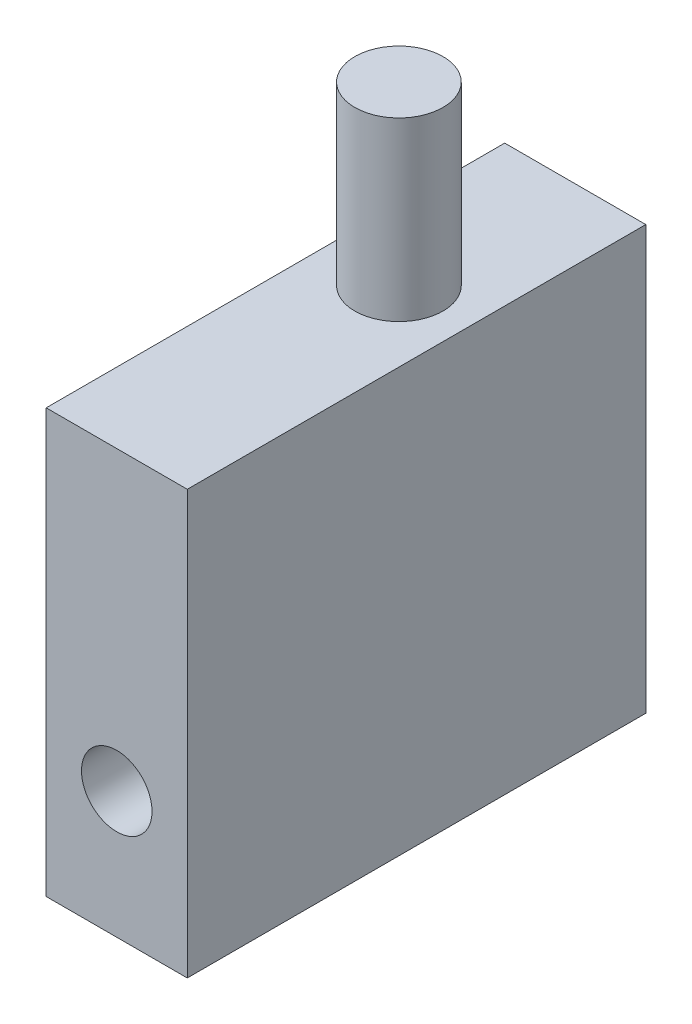
ISO-10303-21;
HEADER;
FILE_DESCRIPTION(('STEP AP214'),'2;1');
FILE_NAME('part.step','',(''),(''),'','','');
FILE_SCHEMA(('AUTOMOTIVE_DESIGN { 1 0 10303 214 1 1 1 1 }'));
ENDSEC;
DATA;
#1=APPLICATION_CONTEXT('core data for automotive mechanical design processes');
#2=APPLICATION_PROTOCOL_DEFINITION('international standard','automotive_design',2000,#1);
#3=PRODUCT_CONTEXT('',#1,'mechanical');
#4=PRODUCT('Part','Part','',(#3));
#5=PRODUCT_RELATED_PRODUCT_CATEGORY('part','',(#4));
#6=PRODUCT_DEFINITION_FORMATION('','',#4);
#7=PRODUCT_DEFINITION_CONTEXT('part definition',#1,'design');
#8=PRODUCT_DEFINITION('design','',#6,#7);
#9=PRODUCT_DEFINITION_SHAPE('','',#8);
#10=(LENGTH_UNIT() NAMED_UNIT(*) SI_UNIT(.MILLI.,.METRE.));
#11=(NAMED_UNIT(*) PLANE_ANGLE_UNIT() SI_UNIT($,.RADIAN.));
#12=(NAMED_UNIT(*) SI_UNIT($,.STERADIAN.) SOLID_ANGLE_UNIT());
#13=UNCERTAINTY_MEASURE_WITH_UNIT(LENGTH_MEASURE(1.E-05),#10,'distance_accuracy_value','');
#14=(GEOMETRIC_REPRESENTATION_CONTEXT(3) GLOBAL_UNCERTAINTY_ASSIGNED_CONTEXT((#13)) GLOBAL_UNIT_ASSIGNED_CONTEXT((#10,
#11,#12)) REPRESENTATION_CONTEXT('',''));
#15=CARTESIAN_POINT('',(0.,0.,0.));
#16=DIRECTION('',(0.,0.,1.));
#17=DIRECTION('',(1.,0.,0.));
#18=AXIS2_PLACEMENT_3D('',#15,#16,#17);
#19=CARTESIAN_POINT('',(0.,0.,13.));
#20=DIRECTION('',(1.,0.,0.));
#21=DIRECTION('',(0.,0.,-1.));
#22=AXIS2_PLACEMENT_3D('',#19,#20,#21);
#23=PLANE('',#22);
#24=DIRECTION('',(0.,-1.,0.));
#25=VECTOR('',#24,1.);
#26=CARTESIAN_POINT('',(0.,0.,0.));
#27=LINE('',#26,#25);
#28=CARTESIAN_POINT('',(0.,12.,0.));
#29=VERTEX_POINT('',#28);
#30=CARTESIAN_POINT('',(0.,0.,0.));
#31=VERTEX_POINT('',#30);
#32=EDGE_CURVE('E110',#29,#31,#27,.T.);
#33=ORIENTED_EDGE('',*,*,#32,.T.);
#34=DIRECTION('',(0.,0.,-1.));
#35=VECTOR('',#34,1.);
#36=CARTESIAN_POINT('',(0.,0.,13.));
#37=LINE('',#36,#35);
#38=CARTESIAN_POINT('',(0.,0.,13.));
#39=VERTEX_POINT('',#38);
#40=EDGE_CURVE('E42',#39,#31,#37,.T.);
#41=ORIENTED_EDGE('',*,*,#40,.F.);
#42=DIRECTION('',(0.,-1.,0.));
#43=VECTOR('',#42,1.);
#44=CARTESIAN_POINT('',(0.,0.,13.));
#45=LINE('',#44,#43);
#46=CARTESIAN_POINT('',(0.,12.,13.));
#47=VERTEX_POINT('',#46);
#48=EDGE_CURVE('E93',#47,#39,#45,.T.);
#49=ORIENTED_EDGE('',*,*,#48,.F.);
#50=DIRECTION('',(0.,0.,-1.));
#51=VECTOR('',#50,1.);
#52=CARTESIAN_POINT('',(0.,12.,13.));
#53=LINE('',#52,#51);
#54=EDGE_CURVE('E106',#47,#29,#53,.T.);
#55=ORIENTED_EDGE('',*,*,#54,.T.);
#56=EDGE_LOOP('',(#33,#41,#49,#55));
#57=FACE_BOUND('',#56,.T.);
#58=ADVANCED_FACE('F39',(#57),#23,.F.);
#59=CARTESIAN_POINT('',(0.,0.,13.));
#60=DIRECTION('',(0.,1.,0.));
#61=DIRECTION('',(0.,0.,1.));
#62=AXIS2_PLACEMENT_3D('',#59,#60,#61);
#63=PLANE('',#62);
#64=DIRECTION('',(1.,0.,0.));
#65=VECTOR('',#64,1.);
#66=CARTESIAN_POINT('',(0.,0.,0.));
#67=LINE('',#66,#65);
#68=CARTESIAN_POINT('',(4.,0.,0.));
#69=VERTEX_POINT('',#68);
#70=EDGE_CURVE('E99',#31,#69,#67,.T.);
#71=ORIENTED_EDGE('',*,*,#70,.T.);
#72=DIRECTION('',(0.,0.,-1.));
#73=VECTOR('',#72,1.);
#74=CARTESIAN_POINT('',(4.,0.,13.));
#75=LINE('',#74,#73);
#76=CARTESIAN_POINT('',(4.,0.,13.));
#77=VERTEX_POINT('',#76);
#78=EDGE_CURVE('E97',#77,#69,#75,.T.);
#79=ORIENTED_EDGE('',*,*,#78,.F.);
#80=DIRECTION('',(1.,0.,0.));
#81=VECTOR('',#80,1.);
#82=CARTESIAN_POINT('',(0.,0.,13.));
#83=LINE('',#82,#81);
#84=EDGE_CURVE('E88',#39,#77,#83,.T.);
#85=ORIENTED_EDGE('',*,*,#84,.F.);
#86=ORIENTED_EDGE('',*,*,#40,.T.);
#87=EDGE_LOOP('',(#71,#79,#85,#86));
#88=FACE_BOUND('',#87,.T.);
#89=ADVANCED_FACE('F98',(#88),#63,.F.);
#90=CARTESIAN_POINT('',(4.,0.,13.));
#91=DIRECTION('',(-1.,0.,0.));
#92=DIRECTION('',(0.,0.,1.));
#93=AXIS2_PLACEMENT_3D('',#90,#91,#92);
#94=PLANE('',#93);
#95=DIRECTION('',(0.,1.,0.));
#96=VECTOR('',#95,1.);
#97=CARTESIAN_POINT('',(4.,0.,0.));
#98=LINE('',#97,#96);
#99=CARTESIAN_POINT('',(4.,12.,0.));
#100=VERTEX_POINT('',#99);
#101=EDGE_CURVE('E74',#69,#100,#98,.T.);
#102=ORIENTED_EDGE('',*,*,#101,.T.);
#103=DIRECTION('',(0.,0.,-1.));
#104=VECTOR('',#103,1.);
#105=CARTESIAN_POINT('',(4.,12.,13.));
#106=LINE('',#105,#104);
#107=CARTESIAN_POINT('',(4.,12.,13.));
#108=VERTEX_POINT('',#107);
#109=EDGE_CURVE('E101',#108,#100,#106,.T.);
#110=ORIENTED_EDGE('',*,*,#109,.F.);
#111=DIRECTION('',(0.,1.,0.));
#112=VECTOR('',#111,1.);
#113=CARTESIAN_POINT('',(4.,0.,13.));
#114=LINE('',#113,#112);
#115=EDGE_CURVE('E91',#77,#108,#114,.T.);
#116=ORIENTED_EDGE('',*,*,#115,.F.);
#117=ORIENTED_EDGE('',*,*,#78,.T.);
#118=EDGE_LOOP('',(#102,#110,#116,#117));
#119=FACE_BOUND('',#118,.T.);
#120=ADVANCED_FACE('F102',(#119),#94,.F.);
#121=CARTESIAN_POINT('',(0.,12.,13.));
#122=DIRECTION('',(0.,-1.,0.));
#123=DIRECTION('',(0.,0.,-1.));
#124=AXIS2_PLACEMENT_3D('',#121,#122,#123);
#125=PLANE('',#124);
#126=CARTESIAN_POINT('',(2.,12.,5.));
#127=DIRECTION('',(0.,1.,0.));
#128=DIRECTION('',(0.,0.,1.));
#129=AXIS2_PLACEMENT_3D('',#126,#127,#128);
#130=CIRCLE('',#129,1.25);
#131=CARTESIAN_POINT('',(2.,12.,6.25));
#132=VERTEX_POINT('',#131);
#133=EDGE_CURVE('E11',#132,#132,#130,.T.);
#134=ORIENTED_EDGE('',*,*,#133,.F.);
#135=EDGE_LOOP('',(#134));
#136=FACE_BOUND('',#135,.T.);
#137=DIRECTION('',(-1.,0.,0.));
#138=VECTOR('',#137,1.);
#139=CARTESIAN_POINT('',(0.,12.,0.));
#140=LINE('',#139,#138);
#141=EDGE_CURVE('E80',#100,#29,#140,.T.);
#142=ORIENTED_EDGE('',*,*,#141,.T.);
#143=ORIENTED_EDGE('',*,*,#54,.F.);
#144=DIRECTION('',(-1.,0.,0.));
#145=VECTOR('',#144,1.);
#146=CARTESIAN_POINT('',(0.,12.,13.));
#147=LINE('',#146,#145);
#148=EDGE_CURVE('E57',#108,#47,#147,.T.);
#149=ORIENTED_EDGE('',*,*,#148,.F.);
#150=ORIENTED_EDGE('',*,*,#109,.T.);
#151=EDGE_LOOP('',(#142,#143,#149,#150));
#152=FACE_BOUND('',#151,.T.);
#153=ADVANCED_FACE('F124',(#136,#152),#125,.F.);
#154=CARTESIAN_POINT('',(0.,0.,13.));
#155=DIRECTION('',(0.,0.,-1.));
#156=DIRECTION('',(-1.,0.,0.));
#157=AXIS2_PLACEMENT_3D('',#154,#155,#156);
#158=PLANE('',#157);
#159=CARTESIAN_POINT('',(2.,3.59,13.));
#160=DIRECTION('',(0.,0.,1.));
#161=DIRECTION('',(1.,0.,0.));
#162=AXIS2_PLACEMENT_3D('',#159,#160,#161);
#163=CIRCLE('',#162,1.);
#164=CARTESIAN_POINT('',(3.,3.59,13.));
#165=VERTEX_POINT('',#164);
#166=EDGE_CURVE('E135',#165,#165,#163,.T.);
#167=ORIENTED_EDGE('',*,*,#166,.F.);
#168=EDGE_LOOP('',(#167));
#169=FACE_BOUND('',#168,.T.);
#170=ORIENTED_EDGE('',*,*,#48,.T.);
#171=ORIENTED_EDGE('',*,*,#84,.T.);
#172=ORIENTED_EDGE('',*,*,#115,.T.);
#173=ORIENTED_EDGE('',*,*,#148,.T.);
#174=EDGE_LOOP('',(#170,#171,#172,#173));
#175=FACE_BOUND('',#174,.T.);
#176=ADVANCED_FACE('F89',(#169,#175),#158,.F.);
#177=CARTESIAN_POINT('',(0.,0.,0.));
#178=DIRECTION('',(0.,0.,-1.));
#179=DIRECTION('',(-1.,0.,0.));
#180=AXIS2_PLACEMENT_3D('',#177,#178,#179);
#181=PLANE('',#180);
#182=CARTESIAN_POINT('',(2.,3.59,0.));
#183=DIRECTION('',(0.,0.,1.));
#184=DIRECTION('',(1.,0.,0.));
#185=AXIS2_PLACEMENT_3D('',#182,#183,#184);
#186=CIRCLE('',#185,1.);
#187=CARTESIAN_POINT('',(3.,3.59,0.));
#188=VERTEX_POINT('',#187);
#189=EDGE_CURVE('E134',#188,#188,#186,.T.);
#190=ORIENTED_EDGE('',*,*,#189,.T.);
#191=EDGE_LOOP('',(#190));
#192=FACE_BOUND('',#191,.T.);
#193=ORIENTED_EDGE('',*,*,#32,.F.);
#194=ORIENTED_EDGE('',*,*,#141,.F.);
#195=ORIENTED_EDGE('',*,*,#101,.F.);
#196=ORIENTED_EDGE('',*,*,#70,.F.);
#197=EDGE_LOOP('',(#193,#194,#195,#196));
#198=FACE_BOUND('',#197,.T.);
#199=ADVANCED_FACE('F127',(#192,#198),#181,.T.);
#200=CARTESIAN_POINT('',(2.,17.,5.));
#201=DIRECTION('',(0.,-1.,0.));
#202=DIRECTION('',(0.,0.,-1.));
#203=AXIS2_PLACEMENT_3D('',#200,#201,#202);
#204=CYLINDRICAL_SURFACE('',#203,1.25);
#205=CARTESIAN_POINT('',(2.,17.,5.));
#206=DIRECTION('',(0.,1.,0.));
#207=DIRECTION('',(0.,0.,1.));
#208=AXIS2_PLACEMENT_3D('',#205,#206,#207);
#209=CIRCLE('',#208,1.25);
#210=CARTESIAN_POINT('',(2.,17.,6.25));
#211=VERTEX_POINT('',#210);
#212=EDGE_CURVE('E114',#211,#211,#209,.T.);
#213=ORIENTED_EDGE('',*,*,#212,.F.);
#214=EDGE_LOOP('',(#213));
#215=FACE_BOUND('',#214,.T.);
#216=ORIENTED_EDGE('',*,*,#133,.T.);
#217=EDGE_LOOP('',(#216));
#218=FACE_BOUND('',#217,.T.);
#219=ADVANCED_FACE('F157',(#215,#218),#204,.T.);
#220=CARTESIAN_POINT('',(2.,17.,5.));
#221=DIRECTION('',(0.,1.,0.));
#222=DIRECTION('',(0.,0.,1.));
#223=AXIS2_PLACEMENT_3D('',#220,#221,#222);
#224=PLANE('',#223);
#225=ORIENTED_EDGE('',*,*,#212,.T.);
#226=EDGE_LOOP('',(#225));
#227=FACE_BOUND('',#226,.T.);
#228=ADVANCED_FACE('F147',(#227),#224,.T.);
#229=CARTESIAN_POINT('',(2.,3.59,0.));
#230=DIRECTION('',(0.,0.,1.));
#231=DIRECTION('',(1.,0.,0.));
#232=AXIS2_PLACEMENT_3D('',#229,#230,#231);
#233=CYLINDRICAL_SURFACE('',#232,1.);
#234=CARTESIAN_POINT('',(3.,3.59,0.));
#235=CARTESIAN_POINT('',(3.,3.59,0.135416666666666));
#236=CARTESIAN_POINT('',(3.,3.59,0.270833333333333));
#237=CARTESIAN_POINT('',(3.,3.59,0.541666666666667));
#238=CARTESIAN_POINT('',(3.,3.59,0.677083333333333));
#239=CARTESIAN_POINT('',(3.,3.59,0.947916666666667));
#240=CARTESIAN_POINT('',(3.,3.59,1.08333333333333));
#241=CARTESIAN_POINT('',(3.,3.59,1.35416666666667));
#242=CARTESIAN_POINT('',(3.,3.59,1.48958333333333));
#243=CARTESIAN_POINT('',(3.,3.59,1.76041666666667));
#244=CARTESIAN_POINT('',(3.,3.59,1.89583333333333));
#245=CARTESIAN_POINT('',(3.,3.59,2.16666666666667));
#246=CARTESIAN_POINT('',(3.,3.59,2.30208333333333));
#247=CARTESIAN_POINT('',(3.,3.59,2.57291666666667));
#248=CARTESIAN_POINT('',(3.,3.59,2.70833333333333));
#249=CARTESIAN_POINT('',(3.,3.59,2.97916666666667));
#250=CARTESIAN_POINT('',(3.,3.59,3.11458333333333));
#251=CARTESIAN_POINT('',(3.,3.59,3.38541666666667));
#252=CARTESIAN_POINT('',(3.,3.59,3.52083333333333));
#253=CARTESIAN_POINT('',(3.,3.59,3.79166666666667));
#254=CARTESIAN_POINT('',(3.,3.59,3.92708333333333));
#255=CARTESIAN_POINT('',(3.,3.59,4.19791666666667));
#256=CARTESIAN_POINT('',(3.,3.59,4.33333333333333));
#257=CARTESIAN_POINT('',(3.,3.59,4.60416666666667));
#258=CARTESIAN_POINT('',(3.,3.59,4.73958333333333));
#259=CARTESIAN_POINT('',(3.,3.59,5.01041666666667));
#260=CARTESIAN_POINT('',(3.,3.59,5.14583333333333));
#261=CARTESIAN_POINT('',(3.,3.59,5.41666666666667));
#262=CARTESIAN_POINT('',(3.,3.59,5.55208333333333));
#263=CARTESIAN_POINT('',(3.,3.59,5.82291666666667));
#264=CARTESIAN_POINT('',(3.,3.59,5.95833333333333));
#265=CARTESIAN_POINT('',(3.,3.59,6.22916666666667));
#266=CARTESIAN_POINT('',(3.,3.59,6.36458333333333));
#267=CARTESIAN_POINT('',(3.,3.59,6.63541666666667));
#268=CARTESIAN_POINT('',(3.,3.59,6.77083333333333));
#269=CARTESIAN_POINT('',(3.,3.59,7.04166666666667));
#270=CARTESIAN_POINT('',(3.,3.59,7.17708333333333));
#271=CARTESIAN_POINT('',(3.,3.59,7.44791666666667));
#272=CARTESIAN_POINT('',(3.,3.59,7.58333333333333));
#273=CARTESIAN_POINT('',(3.,3.59,7.85416666666667));
#274=CARTESIAN_POINT('',(3.,3.59,7.98958333333333));
#275=CARTESIAN_POINT('',(3.,3.59,8.26041666666667));
#276=CARTESIAN_POINT('',(3.,3.59,8.39583333333333));
#277=CARTESIAN_POINT('',(3.,3.59,8.66666666666667));
#278=CARTESIAN_POINT('',(3.,3.59,8.80208333333333));
#279=CARTESIAN_POINT('',(3.,3.59,9.07291666666667));
#280=CARTESIAN_POINT('',(3.,3.59,9.20833333333333));
#281=CARTESIAN_POINT('',(3.,3.59,9.47916666666667));
#282=CARTESIAN_POINT('',(3.,3.59,9.61458333333333));
#283=CARTESIAN_POINT('',(3.,3.59,9.88541666666667));
#284=CARTESIAN_POINT('',(3.,3.59,10.0208333333333));
#285=CARTESIAN_POINT('',(3.,3.59,10.2916666666667));
#286=CARTESIAN_POINT('',(3.,3.59,10.4270833333333));
#287=CARTESIAN_POINT('',(3.,3.59,10.6979166666667));
#288=CARTESIAN_POINT('',(3.,3.59,10.8333333333333));
#289=CARTESIAN_POINT('',(3.,3.59,11.1041666666667));
#290=CARTESIAN_POINT('',(3.,3.59,11.2395833333333));
#291=CARTESIAN_POINT('',(3.,3.59,11.5104166666667));
#292=CARTESIAN_POINT('',(3.,3.59,11.6458333333333));
#293=CARTESIAN_POINT('',(3.,3.59,11.9166666666667));
#294=CARTESIAN_POINT('',(3.,3.59,12.0520833333333));
#295=CARTESIAN_POINT('',(3.,3.59,12.3229166666667));
#296=CARTESIAN_POINT('',(3.,3.59,12.4583333333333));
#297=CARTESIAN_POINT('',(3.,3.59,12.7291666666667));
#298=CARTESIAN_POINT('',(3.,3.59,12.8645833333333));
#299=CARTESIAN_POINT('',(3.,3.59,13.));
#300=B_SPLINE_CURVE_WITH_KNOTS('',3,(#234,#235,#236,#237,#238,#239,#240,#241,#242,#243,#244,
#245,#246,#247,#248,#249,#250,#251,#252,#253,#254,#255,#256,#257,#258,#259,#260,#261,#262,#263,
#264,#265,#266,#267,#268,#269,#270,#271,#272,#273,#274,#275,#276,#277,#278,#279,#280,#281,#282,
#283,#284,#285,#286,#287,#288,#289,#290,#291,#292,#293,#294,#295,#296,#297,#298,#299),
.UNSPECIFIED.,.F.,.F.,(4,2,2,2,2,2,2,2,2,2,2,2,2,2,2,2,2,2,2,2,2,2,2,2,2,2,2,2,2,2,2,2,4),(0.,
0.40625,0.8125,1.21875,1.625,2.03125,2.4375,2.84375,3.25,3.65625,4.0625,4.46875,4.875,5.28125,
5.6875,6.09375,6.5,6.90625,7.3125,7.71875,8.125,8.53125,8.9375,9.34375,9.75,10.15625,10.5625,
10.96875,11.375,11.78125,12.1875,12.59375,13.),.UNSPECIFIED.);
#301=EDGE_CURVE('BSEAM144',#188,#165,#300,.T.);
#302=ORIENTED_EDGE('',*,*,#189,.F.);
#303=ORIENTED_EDGE('',*,*,#166,.T.);
#304=ORIENTED_EDGE('',*,*,#301,.T.);
#305=ORIENTED_EDGE('',*,*,#301,.F.);
#306=EDGE_LOOP('',(#302,#304,#303,#305));
#307=FACE_BOUND('',#306,.T.);
#308=ADVANCED_FACE('F144',(#307),#233,.F.);
#309=CLOSED_SHELL('',(#58,#89,#120,#153,#176,#199,#219,#228,#308));
#310=MANIFOLD_SOLID_BREP('B2',#309);
#311=ADVANCED_BREP_SHAPE_REPRESENTATION('',(#18,#310),#14);
#312=SHAPE_DEFINITION_REPRESENTATION(#9,#311);
ENDSEC;
END-ISO-10303-21;
